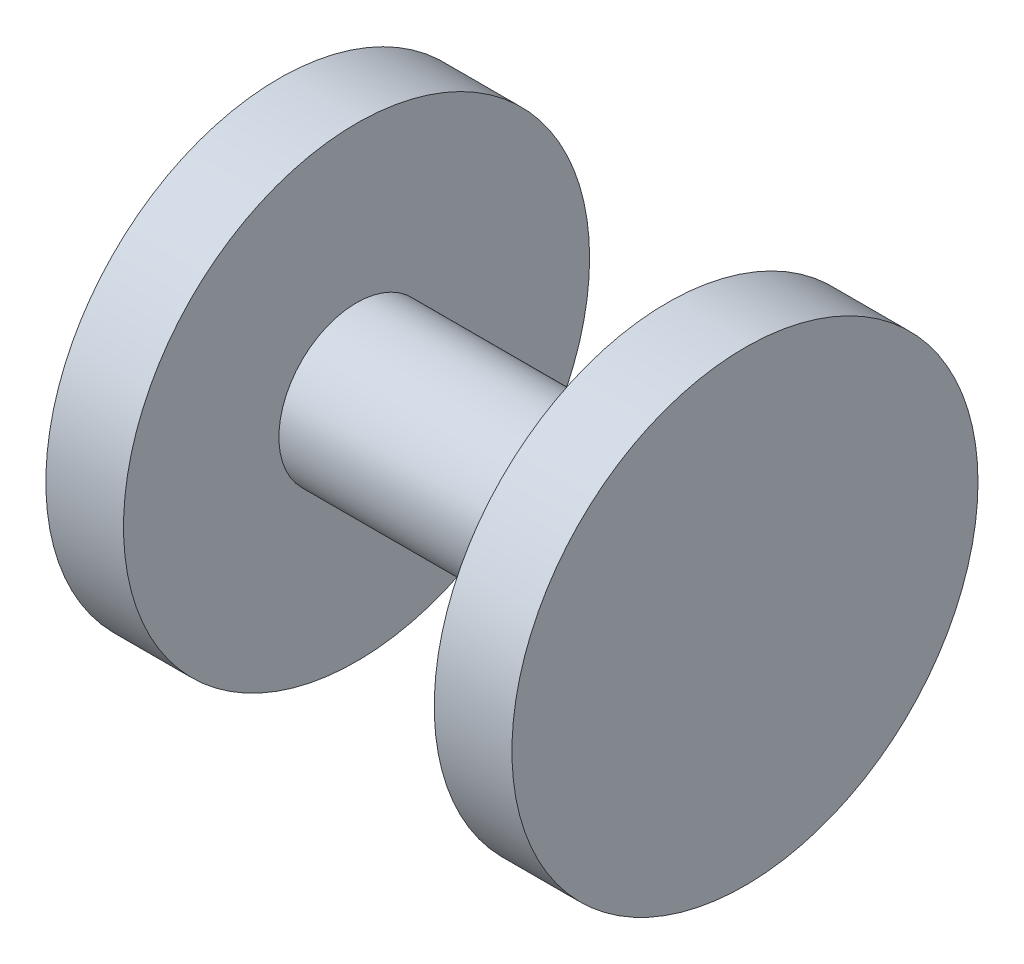
ISO-10303-21;
HEADER;
FILE_DESCRIPTION(('STEP AP214'),'2;1');
FILE_NAME('part.step','',(''),(''),'','','');
FILE_SCHEMA(('AUTOMOTIVE_DESIGN { 1 0 10303 214 1 1 1 1 }'));
ENDSEC;
DATA;
#1=APPLICATION_CONTEXT('core data for automotive mechanical design processes');
#2=APPLICATION_PROTOCOL_DEFINITION('international standard','automotive_design',2000,#1);
#3=PRODUCT_CONTEXT('',#1,'mechanical');
#4=PRODUCT('Part','Part','',(#3));
#5=PRODUCT_RELATED_PRODUCT_CATEGORY('part','',(#4));
#6=PRODUCT_DEFINITION_FORMATION('','',#4);
#7=PRODUCT_DEFINITION_CONTEXT('part definition',#1,'design');
#8=PRODUCT_DEFINITION('design','',#6,#7);
#9=PRODUCT_DEFINITION_SHAPE('','',#8);
#10=(LENGTH_UNIT() NAMED_UNIT(*) SI_UNIT(.MILLI.,.METRE.));
#11=(NAMED_UNIT(*) PLANE_ANGLE_UNIT() SI_UNIT($,.RADIAN.));
#12=(NAMED_UNIT(*) SI_UNIT($,.STERADIAN.) SOLID_ANGLE_UNIT());
#13=UNCERTAINTY_MEASURE_WITH_UNIT(LENGTH_MEASURE(1.E-05),#10,'distance_accuracy_value','');
#14=(GEOMETRIC_REPRESENTATION_CONTEXT(3) GLOBAL_UNCERTAINTY_ASSIGNED_CONTEXT((#13)) GLOBAL_UNIT_ASSIGNED_CONTEXT((#10,
#11,#12)) REPRESENTATION_CONTEXT('',''));
#15=CARTESIAN_POINT('',(0.,0.,0.));
#16=DIRECTION('',(0.,0.,1.));
#17=DIRECTION('',(1.,0.,0.));
#18=AXIS2_PLACEMENT_3D('',#15,#16,#17);
#19=CARTESIAN_POINT('',(0.,0.,0.));
#20=DIRECTION('',(1.,0.,0.));
#21=DIRECTION('',(0.,0.,-1.));
#22=AXIS2_PLACEMENT_3D('',#19,#20,#21);
#23=PLANE('',#22);
#24=CARTESIAN_POINT('',(0.,0.,0.));
#25=DIRECTION('',(1.,0.,0.));
#26=DIRECTION('',(0.,0.,-1.));
#27=AXIS2_PLACEMENT_3D('',#24,#25,#26);
#28=CIRCLE('',#27,15.);
#29=CARTESIAN_POINT('',(0.,0.,-15.));
#30=VERTEX_POINT('',#29);
#31=EDGE_CURVE('E55',#30,#30,#28,.T.);
#32=ORIENTED_EDGE('',*,*,#31,.F.);
#33=EDGE_LOOP('',(#32));
#34=FACE_BOUND('',#33,.T.);
#35=ADVANCED_FACE('F33',(#34),#23,.F.);
#36=CARTESIAN_POINT('',(30.,0.,0.));
#37=DIRECTION('',(-1.,0.,0.));
#38=DIRECTION('',(0.,0.,1.));
#39=AXIS2_PLACEMENT_3D('',#36,#37,#38);
#40=PLANE('',#39);
#41=CARTESIAN_POINT('',(30.,0.,0.));
#42=DIRECTION('',(1.,0.,0.));
#43=DIRECTION('',(0.,0.,-1.));
#44=AXIS2_PLACEMENT_3D('',#41,#42,#43);
#45=CIRCLE('',#44,15.);
#46=CARTESIAN_POINT('',(30.,0.,-15.));
#47=VERTEX_POINT('',#46);
#48=EDGE_CURVE('E10',#47,#47,#45,.T.);
#49=ORIENTED_EDGE('',*,*,#48,.T.);
#50=EDGE_LOOP('',(#49));
#51=FACE_BOUND('',#50,.T.);
#52=ADVANCED_FACE('F62',(#51),#40,.F.);
#53=CARTESIAN_POINT('',(30.,0.,0.));
#54=DIRECTION('',(1.,0.,0.));
#55=DIRECTION('',(0.,0.,-1.));
#56=AXIS2_PLACEMENT_3D('',#53,#54,#55);
#57=CYLINDRICAL_SURFACE('',#56,15.);
#58=ORIENTED_EDGE('',*,*,#48,.F.);
#59=EDGE_LOOP('',(#58));
#60=FACE_BOUND('',#59,.T.);
#61=CARTESIAN_POINT('',(25.,0.,0.));
#62=DIRECTION('',(1.,0.,0.));
#63=DIRECTION('',(0.,0.,-1.));
#64=AXIS2_PLACEMENT_3D('',#61,#62,#63);
#65=CIRCLE('',#64,15.);
#66=CARTESIAN_POINT('',(25.,0.,-15.));
#67=VERTEX_POINT('',#66);
#68=EDGE_CURVE('E39',#67,#67,#65,.T.);
#69=ORIENTED_EDGE('',*,*,#68,.T.);
#70=EDGE_LOOP('',(#69));
#71=FACE_BOUND('',#70,.T.);
#72=ADVANCED_FACE('F66',(#60,#71),#57,.T.);
#73=CARTESIAN_POINT('',(25.,0.,0.));
#74=DIRECTION('',(1.,0.,0.));
#75=DIRECTION('',(0.,0.,-1.));
#76=AXIS2_PLACEMENT_3D('',#73,#74,#75);
#77=PLANE('',#76);
#78=ORIENTED_EDGE('',*,*,#68,.F.);
#79=EDGE_LOOP('',(#78));
#80=FACE_BOUND('',#79,.T.);
#81=CARTESIAN_POINT('',(25.,0.,0.));
#82=DIRECTION('',(1.,0.,0.));
#83=DIRECTION('',(0.,0.,-1.));
#84=AXIS2_PLACEMENT_3D('',#81,#82,#83);
#85=CIRCLE('',#84,5.);
#86=CARTESIAN_POINT('',(25.,0.,-5.));
#87=VERTEX_POINT('',#86);
#88=EDGE_CURVE('E43',#87,#87,#85,.T.);
#89=ORIENTED_EDGE('',*,*,#88,.T.);
#90=EDGE_LOOP('',(#89));
#91=FACE_BOUND('',#90,.T.);
#92=ADVANCED_FACE('F70',(#80,#91),#77,.F.);
#93=CARTESIAN_POINT('',(30.,0.,0.));
#94=DIRECTION('',(1.,0.,0.));
#95=DIRECTION('',(0.,0.,-1.));
#96=AXIS2_PLACEMENT_3D('',#93,#94,#95);
#97=CYLINDRICAL_SURFACE('',#96,5.);
#98=ORIENTED_EDGE('',*,*,#88,.F.);
#99=EDGE_LOOP('',(#98));
#100=FACE_BOUND('',#99,.T.);
#101=CARTESIAN_POINT('',(5.,0.,0.));
#102=DIRECTION('',(1.,0.,0.));
#103=DIRECTION('',(0.,0.,-1.));
#104=AXIS2_PLACEMENT_3D('',#101,#102,#103);
#105=CIRCLE('',#104,5.);
#106=CARTESIAN_POINT('',(5.,0.,-5.));
#107=VERTEX_POINT('',#106);
#108=EDGE_CURVE('E47',#107,#107,#105,.T.);
#109=ORIENTED_EDGE('',*,*,#108,.T.);
#110=EDGE_LOOP('',(#109));
#111=FACE_BOUND('',#110,.T.);
#112=ADVANCED_FACE('F76',(#100,#111),#97,.T.);
#113=CARTESIAN_POINT('',(5.,0.,0.));
#114=DIRECTION('',(-1.,0.,0.));
#115=DIRECTION('',(0.,0.,1.));
#116=AXIS2_PLACEMENT_3D('',#113,#114,#115);
#117=PLANE('',#116);
#118=ORIENTED_EDGE('',*,*,#108,.F.);
#119=EDGE_LOOP('',(#118));
#120=FACE_BOUND('',#119,.T.);
#121=CARTESIAN_POINT('',(5.,0.,0.));
#122=DIRECTION('',(1.,0.,0.));
#123=DIRECTION('',(0.,0.,-1.));
#124=AXIS2_PLACEMENT_3D('',#121,#122,#123);
#125=CIRCLE('',#124,15.);
#126=CARTESIAN_POINT('',(5.,0.,-15.));
#127=VERTEX_POINT('',#126);
#128=EDGE_CURVE('E52',#127,#127,#125,.T.);
#129=ORIENTED_EDGE('',*,*,#128,.T.);
#130=EDGE_LOOP('',(#129));
#131=FACE_BOUND('',#130,.T.);
#132=ADVANCED_FACE('F80',(#120,#131),#117,.F.);
#133=CARTESIAN_POINT('',(30.,0.,0.));
#134=DIRECTION('',(1.,0.,0.));
#135=DIRECTION('',(0.,0.,-1.));
#136=AXIS2_PLACEMENT_3D('',#133,#134,#135);
#137=CYLINDRICAL_SURFACE('',#136,15.);
#138=ORIENTED_EDGE('',*,*,#128,.F.);
#139=EDGE_LOOP('',(#138));
#140=FACE_BOUND('',#139,.T.);
#141=ORIENTED_EDGE('',*,*,#31,.T.);
#142=EDGE_LOOP('',(#141));
#143=FACE_BOUND('',#142,.T.);
#144=ADVANCED_FACE('F59',(#140,#143),#137,.T.);
#145=CLOSED_SHELL('',(#35,#52,#72,#92,#112,#132,#144));
#146=MANIFOLD_SOLID_BREP('B2',#145);
#147=ADVANCED_BREP_SHAPE_REPRESENTATION('',(#18,#146),#14);
#148=SHAPE_DEFINITION_REPRESENTATION(#9,#147);
ENDSEC;
END-ISO-10303-21;
